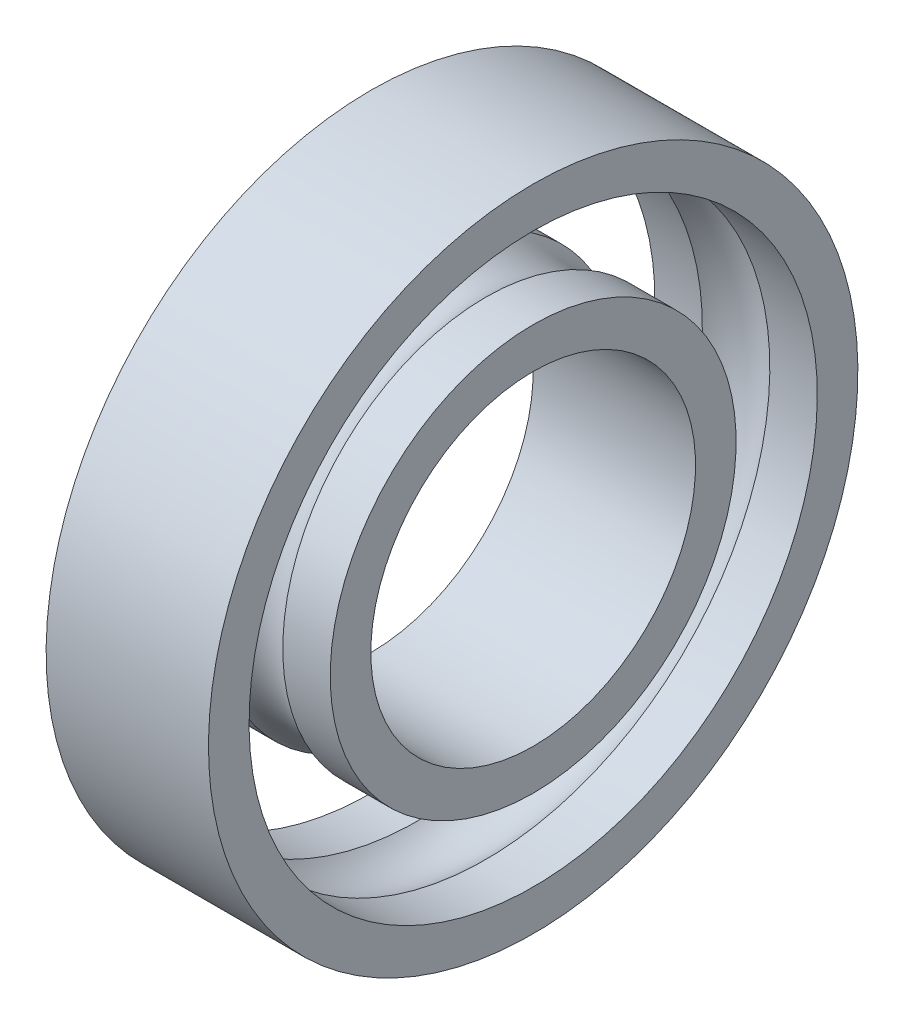
ISO-10303-21;
HEADER;
FILE_DESCRIPTION(('STEP AP214'),'2;1');
FILE_NAME('part.step','',(''),(''),'','','');
FILE_SCHEMA(('AUTOMOTIVE_DESIGN { 1 0 10303 214 1 1 1 1 }'));
ENDSEC;
DATA;
#1=APPLICATION_CONTEXT('core data for automotive mechanical design processes');
#2=APPLICATION_PROTOCOL_DEFINITION('international standard','automotive_design',2000,#1);
#3=PRODUCT_CONTEXT('',#1,'mechanical');
#4=PRODUCT('Part','Part','',(#3));
#5=PRODUCT_RELATED_PRODUCT_CATEGORY('part','',(#4));
#6=PRODUCT_DEFINITION_FORMATION('','',#4);
#7=PRODUCT_DEFINITION_CONTEXT('part definition',#1,'design');
#8=PRODUCT_DEFINITION('design','',#6,#7);
#9=PRODUCT_DEFINITION_SHAPE('','',#8);
#10=(LENGTH_UNIT() NAMED_UNIT(*) SI_UNIT(.MILLI.,.METRE.));
#11=(NAMED_UNIT(*) PLANE_ANGLE_UNIT() SI_UNIT($,.RADIAN.));
#12=(NAMED_UNIT(*) SI_UNIT($,.STERADIAN.) SOLID_ANGLE_UNIT());
#13=UNCERTAINTY_MEASURE_WITH_UNIT(LENGTH_MEASURE(1.E-05),#10,'distance_accuracy_value','');
#14=(GEOMETRIC_REPRESENTATION_CONTEXT(3) GLOBAL_UNCERTAINTY_ASSIGNED_CONTEXT((#13)) GLOBAL_UNIT_ASSIGNED_CONTEXT((#10,
#11,#12)) REPRESENTATION_CONTEXT('',''));
#15=CARTESIAN_POINT('',(0.,0.,0.));
#16=DIRECTION('',(0.,0.,1.));
#17=DIRECTION('',(1.,0.,0.));
#18=AXIS2_PLACEMENT_3D('',#15,#16,#17);
#19=CARTESIAN_POINT('',(0.,0.,0.));
#20=DIRECTION('',(1.,0.,0.));
#21=DIRECTION('',(0.,0.,-1.));
#22=AXIS2_PLACEMENT_3D('',#19,#20,#21);
#23=CYLINDRICAL_SURFACE('',#22,20.);
#24=DIRECTION('',(1.,0.,0.));
#25=VECTOR('',#24,1.);
#26=CARTESIAN_POINT('',(-10.,20.,0.));
#27=LINE('',#26,#25);
#28=CARTESIAN_POINT('',(-10.,20.,0.));
#29=VERTEX_POINT('',#28);
#30=CARTESIAN_POINT('',(10.,20.,0.));
#31=VERTEX_POINT('',#30);
#32=EDGE_CURVE('E55',#29,#31,#27,.T.);
#33=ORIENTED_EDGE('',*,*,#32,.F.);
#34=CARTESIAN_POINT('',(-10.,0.,0.));
#35=DIRECTION('',(1.,0.,0.));
#36=DIRECTION('',(0.,1.,0.));
#37=AXIS2_PLACEMENT_3D('',#34,#35,#36);
#38=CIRCLE('',#37,20.);
#39=EDGE_CURVE('E12',#29,#29,#38,.T.);
#40=ORIENTED_EDGE('',*,*,#39,.F.);
#41=ORIENTED_EDGE('',*,*,#32,.T.);
#42=CARTESIAN_POINT('',(10.,0.,0.));
#43=DIRECTION('',(1.,0.,0.));
#44=DIRECTION('',(0.,1.,0.));
#45=AXIS2_PLACEMENT_3D('',#42,#43,#44);
#46=CIRCLE('',#45,20.);
#47=EDGE_CURVE('E87',#31,#31,#46,.T.);
#48=ORIENTED_EDGE('',*,*,#47,.T.);
#49=EDGE_LOOP('',(#33,#40,#41,#48));
#50=FACE_BOUND('',#49,.T.);
#51=ADVANCED_FACE('F52',(#50),#23,.F.);
#52=CARTESIAN_POINT('',(-10.,20.,0.));
#53=DIRECTION('',(-1.,0.,0.));
#54=DIRECTION('',(0.,0.,1.));
#55=AXIS2_PLACEMENT_3D('',#52,#53,#54);
#56=PLANE('',#55);
#57=ORIENTED_EDGE('',*,*,#39,.T.);
#58=EDGE_LOOP('',(#57));
#59=FACE_BOUND('',#58,.T.);
#60=CARTESIAN_POINT('',(-10.,0.,0.));
#61=DIRECTION('',(1.,0.,0.));
#62=DIRECTION('',(0.,1.,0.));
#63=AXIS2_PLACEMENT_3D('',#60,#61,#62);
#64=CIRCLE('',#63,25.);
#65=CARTESIAN_POINT('',(-10.,25.,0.));
#66=VERTEX_POINT('',#65);
#67=EDGE_CURVE('E60',#66,#66,#64,.T.);
#68=ORIENTED_EDGE('',*,*,#67,.F.);
#69=EDGE_LOOP('',(#68));
#70=FACE_BOUND('',#69,.T.);
#71=ADVANCED_FACE('F111',(#59,#70),#56,.T.);
#72=CARTESIAN_POINT('',(0.,0.,0.));
#73=DIRECTION('',(1.,0.,0.));
#74=DIRECTION('',(0.,0.,-1.));
#75=AXIS2_PLACEMENT_3D('',#72,#73,#74);
#76=CYLINDRICAL_SURFACE('',#75,25.);
#77=DIRECTION('',(-1.,0.,0.));
#78=VECTOR('',#77,1.);
#79=CARTESIAN_POINT('',(-10.,25.,0.));
#80=LINE('',#79,#78);
#81=CARTESIAN_POINT('',(-4.15331193145904,25.,0.));
#82=VERTEX_POINT('',#81);
#83=EDGE_CURVE('E107',#82,#66,#80,.T.);
#84=ORIENTED_EDGE('',*,*,#83,.F.);
#85=CARTESIAN_POINT('',(-4.15331193145904,0.,0.));
#86=DIRECTION('',(1.,0.,0.));
#87=DIRECTION('',(0.,1.,0.));
#88=AXIS2_PLACEMENT_3D('',#85,#86,#87);
#89=CIRCLE('',#88,25.);
#90=EDGE_CURVE('E104',#82,#82,#89,.T.);
#91=ORIENTED_EDGE('',*,*,#90,.F.);
#92=ORIENTED_EDGE('',*,*,#83,.T.);
#93=ORIENTED_EDGE('',*,*,#67,.T.);
#94=EDGE_LOOP('',(#84,#91,#92,#93));
#95=FACE_BOUND('',#94,.T.);
#96=ADVANCED_FACE('F113',(#95),#76,.T.);
#97=CARTESIAN_POINT('',(0.,0.,0.));
#98=DIRECTION('',(1.,0.,0.));
#99=DIRECTION('',(0.,0.,-1.));
#100=AXIS2_PLACEMENT_3D('',#97,#98,#99);
#101=TOROIDAL_SURFACE('',#100,30.,6.5);
#102=CARTESIAN_POINT('',(0.,30.,0.));
#103=DIRECTION('',(0.,0.,-1.));
#104=DIRECTION('',(1.,0.,0.));
#105=AXIS2_PLACEMENT_3D('',#102,#103,#104);
#106=CIRCLE('',#105,6.5);
#107=CARTESIAN_POINT('',(4.15331193145904,25.,0.));
#108=VERTEX_POINT('',#107);
#109=EDGE_CURVE('E101',#108,#82,#106,.T.);
#110=ORIENTED_EDGE('',*,*,#109,.F.);
#111=CARTESIAN_POINT('',(4.15331193145904,0.,0.));
#112=DIRECTION('',(1.,0.,0.));
#113=DIRECTION('',(0.,1.,0.));
#114=AXIS2_PLACEMENT_3D('',#111,#112,#113);
#115=CIRCLE('',#114,25.);
#116=EDGE_CURVE('E93',#108,#108,#115,.T.);
#117=ORIENTED_EDGE('',*,*,#116,.F.);
#118=ORIENTED_EDGE('',*,*,#109,.T.);
#119=ORIENTED_EDGE('',*,*,#90,.T.);
#120=EDGE_LOOP('',(#110,#117,#118,#119));
#121=FACE_BOUND('',#120,.T.);
#122=ADVANCED_FACE('F117',(#121),#101,.F.);
#123=CARTESIAN_POINT('',(0.,0.,0.));
#124=DIRECTION('',(1.,0.,0.));
#125=DIRECTION('',(0.,0.,-1.));
#126=AXIS2_PLACEMENT_3D('',#123,#124,#125);
#127=CYLINDRICAL_SURFACE('',#126,25.);
#128=DIRECTION('',(-1.,0.,0.));
#129=VECTOR('',#128,1.);
#130=CARTESIAN_POINT('',(4.15331193145904,25.,0.));
#131=LINE('',#130,#129);
#132=CARTESIAN_POINT('',(10.,25.,0.));
#133=VERTEX_POINT('',#132);
#134=EDGE_CURVE('E98',#133,#108,#131,.T.);
#135=ORIENTED_EDGE('',*,*,#134,.F.);
#136=CARTESIAN_POINT('',(10.,0.,0.));
#137=DIRECTION('',(1.,0.,0.));
#138=DIRECTION('',(0.,1.,0.));
#139=AXIS2_PLACEMENT_3D('',#136,#137,#138);
#140=CIRCLE('',#139,25.);
#141=EDGE_CURVE('E91',#133,#133,#140,.T.);
#142=ORIENTED_EDGE('',*,*,#141,.F.);
#143=ORIENTED_EDGE('',*,*,#134,.T.);
#144=ORIENTED_EDGE('',*,*,#116,.T.);
#145=EDGE_LOOP('',(#135,#142,#143,#144));
#146=FACE_BOUND('',#145,.T.);
#147=ADVANCED_FACE('F121',(#146),#127,.T.);
#148=CARTESIAN_POINT('',(10.,20.,0.));
#149=DIRECTION('',(1.,0.,0.));
#150=DIRECTION('',(0.,0.,-1.));
#151=AXIS2_PLACEMENT_3D('',#148,#149,#150);
#152=PLANE('',#151);
#153=ORIENTED_EDGE('',*,*,#141,.T.);
#154=EDGE_LOOP('',(#153));
#155=FACE_BOUND('',#154,.T.);
#156=ORIENTED_EDGE('',*,*,#47,.F.);
#157=EDGE_LOOP('',(#156));
#158=FACE_BOUND('',#157,.T.);
#159=ADVANCED_FACE('F122',(#155,#158),#152,.T.);
#160=CLOSED_SHELL('',(#51,#71,#96,#122,#147,#159));
#161=MANIFOLD_SOLID_BREP('B2',#160);
#162=CARTESIAN_POINT('',(0.,0.,0.));
#163=DIRECTION('',(1.,0.,0.));
#164=DIRECTION('',(0.,0.,-1.));
#165=AXIS2_PLACEMENT_3D('',#162,#163,#164);
#166=CYLINDRICAL_SURFACE('',#165,35.);
#167=DIRECTION('',(1.,0.,0.));
#168=VECTOR('',#167,1.);
#169=CARTESIAN_POINT('',(4.15331193145903,35.,0.));
#170=LINE('',#169,#168);
#171=CARTESIAN_POINT('',(4.15331193145903,35.,0.));
#172=VERTEX_POINT('',#171);
#173=CARTESIAN_POINT('',(10.,35.,0.));
#174=VERTEX_POINT('',#173);
#175=EDGE_CURVE('E186',#172,#174,#170,.T.);
#176=ORIENTED_EDGE('',*,*,#175,.F.);
#177=CARTESIAN_POINT('',(4.15331193145903,0.,0.));
#178=DIRECTION('',(1.,0.,0.));
#179=DIRECTION('',(0.,1.,0.));
#180=AXIS2_PLACEMENT_3D('',#177,#178,#179);
#181=CIRCLE('',#180,35.);
#182=EDGE_CURVE('E50',#172,#172,#181,.T.);
#183=ORIENTED_EDGE('',*,*,#182,.F.);
#184=ORIENTED_EDGE('',*,*,#175,.T.);
#185=CARTESIAN_POINT('',(10.,0.,0.));
#186=DIRECTION('',(1.,0.,0.));
#187=DIRECTION('',(0.,1.,0.));
#188=AXIS2_PLACEMENT_3D('',#185,#186,#187);
#189=CIRCLE('',#188,35.);
#190=EDGE_CURVE('E219',#174,#174,#189,.T.);
#191=ORIENTED_EDGE('',*,*,#190,.T.);
#192=EDGE_LOOP('',(#176,#183,#184,#191));
#193=FACE_BOUND('',#192,.T.);
#194=ADVANCED_FACE('F183',(#193),#166,.F.);
#195=CARTESIAN_POINT('',(0.,0.,0.));
#196=DIRECTION('',(1.,0.,0.));
#197=DIRECTION('',(0.,0.,-1.));
#198=AXIS2_PLACEMENT_3D('',#195,#196,#197);
#199=TOROIDAL_SURFACE('',#198,30.,6.5);
#200=CARTESIAN_POINT('',(0.,30.,0.));
#201=DIRECTION('',(0.,0.,-1.));
#202=DIRECTION('',(1.,0.,0.));
#203=AXIS2_PLACEMENT_3D('',#200,#201,#202);
#204=CIRCLE('',#203,6.5);
#205=CARTESIAN_POINT('',(-4.15331193145903,35.,0.));
#206=VERTEX_POINT('',#205);
#207=EDGE_CURVE('E230',#206,#172,#204,.T.);
#208=ORIENTED_EDGE('',*,*,#207,.F.);
#209=CARTESIAN_POINT('',(-4.15331193145903,0.,0.));
#210=DIRECTION('',(1.,0.,0.));
#211=DIRECTION('',(0.,1.,0.));
#212=AXIS2_PLACEMENT_3D('',#209,#210,#211);
#213=CIRCLE('',#212,35.);
#214=EDGE_CURVE('E192',#206,#206,#213,.T.);
#215=ORIENTED_EDGE('',*,*,#214,.F.);
#216=ORIENTED_EDGE('',*,*,#207,.T.);
#217=ORIENTED_EDGE('',*,*,#182,.T.);
#218=EDGE_LOOP('',(#208,#215,#216,#217));
#219=FACE_BOUND('',#218,.T.);
#220=ADVANCED_FACE('F253',(#219),#199,.F.);
#221=CARTESIAN_POINT('',(0.,0.,0.));
#222=DIRECTION('',(1.,0.,0.));
#223=DIRECTION('',(0.,0.,-1.));
#224=AXIS2_PLACEMENT_3D('',#221,#222,#223);
#225=CYLINDRICAL_SURFACE('',#224,35.);
#226=DIRECTION('',(1.,0.,0.));
#227=VECTOR('',#226,1.);
#228=CARTESIAN_POINT('',(-10.,35.,0.));
#229=LINE('',#228,#227);
#230=CARTESIAN_POINT('',(-10.,35.,0.));
#231=VERTEX_POINT('',#230);
#232=EDGE_CURVE('E245',#231,#206,#229,.T.);
#233=ORIENTED_EDGE('',*,*,#232,.F.);
#234=CARTESIAN_POINT('',(-10.,0.,0.));
#235=DIRECTION('',(1.,0.,0.));
#236=DIRECTION('',(0.,1.,0.));
#237=AXIS2_PLACEMENT_3D('',#234,#235,#236);
#238=CIRCLE('',#237,35.);
#239=EDGE_CURVE('E241',#231,#231,#238,.T.);
#240=ORIENTED_EDGE('',*,*,#239,.F.);
#241=ORIENTED_EDGE('',*,*,#232,.T.);
#242=ORIENTED_EDGE('',*,*,#214,.T.);
#243=EDGE_LOOP('',(#233,#240,#241,#242));
#244=FACE_BOUND('',#243,.T.);
#245=ADVANCED_FACE('F255',(#244),#225,.F.);
#246=CARTESIAN_POINT('',(-10.,35.,0.));
#247=DIRECTION('',(-1.,0.,0.));
#248=DIRECTION('',(0.,0.,1.));
#249=AXIS2_PLACEMENT_3D('',#246,#247,#248);
#250=PLANE('',#249);
#251=ORIENTED_EDGE('',*,*,#239,.T.);
#252=EDGE_LOOP('',(#251));
#253=FACE_BOUND('',#252,.T.);
#254=CARTESIAN_POINT('',(-10.,0.,0.));
#255=DIRECTION('',(1.,0.,0.));
#256=DIRECTION('',(0.,1.,0.));
#257=AXIS2_PLACEMENT_3D('',#254,#255,#256);
#258=CIRCLE('',#257,40.);
#259=CARTESIAN_POINT('',(-10.,40.,0.));
#260=VERTEX_POINT('',#259);
#261=EDGE_CURVE('E228',#260,#260,#258,.T.);
#262=ORIENTED_EDGE('',*,*,#261,.F.);
#263=EDGE_LOOP('',(#262));
#264=FACE_BOUND('',#263,.T.);
#265=ADVANCED_FACE('F259',(#253,#264),#250,.T.);
#266=CARTESIAN_POINT('',(0.,0.,0.));
#267=DIRECTION('',(1.,0.,0.));
#268=DIRECTION('',(0.,0.,-1.));
#269=AXIS2_PLACEMENT_3D('',#266,#267,#268);
#270=CYLINDRICAL_SURFACE('',#269,40.);
#271=DIRECTION('',(-1.,0.,0.));
#272=VECTOR('',#271,1.);
#273=CARTESIAN_POINT('',(-10.,40.,0.));
#274=LINE('',#273,#272);
#275=CARTESIAN_POINT('',(10.,40.,0.));
#276=VERTEX_POINT('',#275);
#277=EDGE_CURVE('E233',#276,#260,#274,.T.);
#278=ORIENTED_EDGE('',*,*,#277,.F.);
#279=CARTESIAN_POINT('',(10.,0.,0.));
#280=DIRECTION('',(1.,0.,0.));
#281=DIRECTION('',(0.,1.,0.));
#282=AXIS2_PLACEMENT_3D('',#279,#280,#281);
#283=CIRCLE('',#282,40.);
#284=EDGE_CURVE('E224',#276,#276,#283,.T.);
#285=ORIENTED_EDGE('',*,*,#284,.F.);
#286=ORIENTED_EDGE('',*,*,#277,.T.);
#287=ORIENTED_EDGE('',*,*,#261,.T.);
#288=EDGE_LOOP('',(#278,#285,#286,#287));
#289=FACE_BOUND('',#288,.T.);
#290=ADVANCED_FACE('F263',(#289),#270,.T.);
#291=CARTESIAN_POINT('',(10.,35.,0.));
#292=DIRECTION('',(1.,0.,0.));
#293=DIRECTION('',(0.,0.,-1.));
#294=AXIS2_PLACEMENT_3D('',#291,#292,#293);
#295=PLANE('',#294);
#296=ORIENTED_EDGE('',*,*,#284,.T.);
#297=EDGE_LOOP('',(#296));
#298=FACE_BOUND('',#297,.T.);
#299=ORIENTED_EDGE('',*,*,#190,.F.);
#300=EDGE_LOOP('',(#299));
#301=FACE_BOUND('',#300,.T.);
#302=ADVANCED_FACE('F264',(#298,#301),#295,.T.);
#303=CLOSED_SHELL('',(#194,#220,#245,#265,#290,#302));
#304=MANIFOLD_SOLID_BREP('B6',#303);
#305=ADVANCED_BREP_SHAPE_REPRESENTATION('',(#18,#161,#304),#14);
#306=SHAPE_DEFINITION_REPRESENTATION(#9,#305);
ENDSEC;
END-ISO-10303-21;
